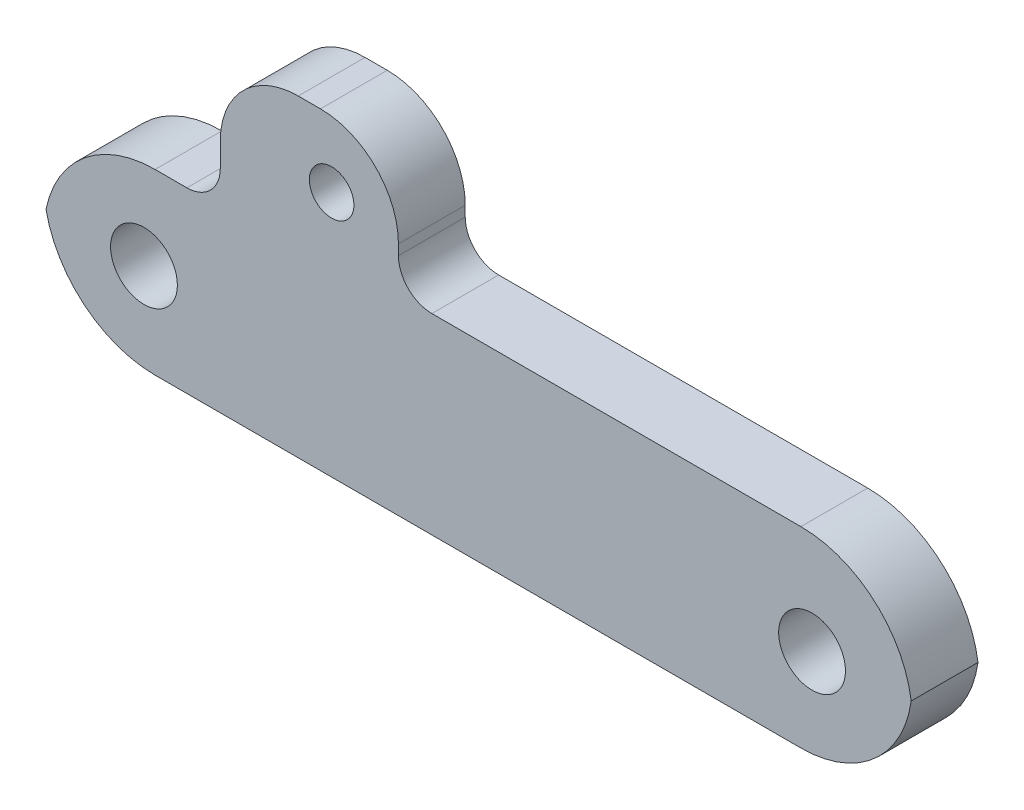
ISO-10303-21;
HEADER;
FILE_DESCRIPTION(('STEP AP214'),'2;1');
FILE_NAME('part.step','',(''),(''),'','','');
FILE_SCHEMA(('AUTOMOTIVE_DESIGN { 1 0 10303 214 1 1 1 1 }'));
ENDSEC;
DATA;
#1=APPLICATION_CONTEXT('core data for automotive mechanical design processes');
#2=APPLICATION_PROTOCOL_DEFINITION('international standard','automotive_design',2000,#1);
#3=PRODUCT_CONTEXT('',#1,'mechanical');
#4=PRODUCT('Part','Part','',(#3));
#5=PRODUCT_RELATED_PRODUCT_CATEGORY('part','',(#4));
#6=PRODUCT_DEFINITION_FORMATION('','',#4);
#7=PRODUCT_DEFINITION_CONTEXT('part definition',#1,'design');
#8=PRODUCT_DEFINITION('design','',#6,#7);
#9=PRODUCT_DEFINITION_SHAPE('','',#8);
#10=(LENGTH_UNIT() NAMED_UNIT(*) SI_UNIT(.MILLI.,.METRE.));
#11=(NAMED_UNIT(*) PLANE_ANGLE_UNIT() SI_UNIT($,.RADIAN.));
#12=(NAMED_UNIT(*) SI_UNIT($,.STERADIAN.) SOLID_ANGLE_UNIT());
#13=UNCERTAINTY_MEASURE_WITH_UNIT(LENGTH_MEASURE(1.E-05),#10,'distance_accuracy_value','');
#14=(GEOMETRIC_REPRESENTATION_CONTEXT(3) GLOBAL_UNCERTAINTY_ASSIGNED_CONTEXT((#13)) GLOBAL_UNIT_ASSIGNED_CONTEXT((#10,
#11,#12)) REPRESENTATION_CONTEXT('',''));
#15=CARTESIAN_POINT('',(0.,0.,0.));
#16=DIRECTION('',(0.,0.,1.));
#17=DIRECTION('',(1.,0.,0.));
#18=AXIS2_PLACEMENT_3D('',#15,#16,#17);
#19=CARTESIAN_POINT('',(0.,0.,3.));
#20=DIRECTION('',(0.,0.,-1.));
#21=DIRECTION('',(-1.,0.,0.));
#22=AXIS2_PLACEMENT_3D('',#19,#20,#21);
#23=PLANE('',#22);
#24=DIRECTION('',(-1.,0.,0.));
#25=VECTOR('',#24,1.);
#26=CARTESIAN_POINT('',(15.9264888743087,8.61058090411915,3.));
#27=LINE('',#26,#25);
#28=CARTESIAN_POINT('',(34.,8.61058090411915,3.));
#29=VERTEX_POINT('',#28);
#30=CARTESIAN_POINT('',(17.4264888743087,8.61058090411915,3.));
#31=VERTEX_POINT('',#30);
#32=EDGE_CURVE('E147',#29,#31,#27,.T.);
#33=ORIENTED_EDGE('',*,*,#32,.T.);
#34=CARTESIAN_POINT('',(17.4264888743087,10.1105809041191,3.));
#35=DIRECTION('',(0.,0.,-1.));
#36=DIRECTION('',(-1.,0.,0.));
#37=AXIS2_PLACEMENT_3D('',#34,#35,#36);
#38=CIRCLE('',#37,1.5);
#39=CARTESIAN_POINT('',(15.9264888743087,10.1105809041191,3.));
#40=VERTEX_POINT('',#39);
#41=EDGE_CURVE('E11',#31,#40,#38,.T.);
#42=ORIENTED_EDGE('',*,*,#41,.T.);
#43=DIRECTION('',(0.,1.,0.));
#44=VECTOR('',#43,1.);
#45=CARTESIAN_POINT('',(15.9264888743087,8.61058090411915,3.));
#46=LINE('',#45,#44);
#47=CARTESIAN_POINT('',(15.9264888743087,10.5706637065519,3.));
#48=VERTEX_POINT('',#47);
#49=EDGE_CURVE('E267',#40,#48,#46,.T.);
#50=ORIENTED_EDGE('',*,*,#49,.T.);
#51=CARTESIAN_POINT('',(12.4264888743087,10.5706637065519,3.));
#52=DIRECTION('',(0.,0.,-1.));
#53=DIRECTION('',(-1.,0.,0.));
#54=AXIS2_PLACEMENT_3D('',#51,#52,#53);
#55=CIRCLE('',#54,3.5);
#56=CARTESIAN_POINT('',(12.4264888743087,14.0706637065519,3.));
#57=VERTEX_POINT('',#56);
#58=EDGE_CURVE('E212',#48,#57,#55,.F.);
#59=ORIENTED_EDGE('',*,*,#58,.T.);
#60=DIRECTION('',(-1.,0.,0.));
#61=VECTOR('',#60,1.);
#62=CARTESIAN_POINT('',(7.92648887430874,14.0706637065519,3.));
#63=LINE('',#62,#61);
#64=CARTESIAN_POINT('',(11.4264888743087,14.0706637065519,3.));
#65=VERTEX_POINT('',#64);
#66=EDGE_CURVE('E258',#57,#65,#63,.T.);
#67=ORIENTED_EDGE('',*,*,#66,.T.);
#68=CARTESIAN_POINT('',(11.4264888743087,10.5706637065519,3.));
#69=DIRECTION('',(0.,0.,-1.));
#70=DIRECTION('',(-1.,0.,0.));
#71=AXIS2_PLACEMENT_3D('',#68,#69,#70);
#72=CIRCLE('',#71,3.5);
#73=CARTESIAN_POINT('',(7.92648887430874,10.5706637065519,3.));
#74=VERTEX_POINT('',#73);
#75=EDGE_CURVE('E210',#65,#74,#72,.F.);
#76=ORIENTED_EDGE('',*,*,#75,.T.);
#77=DIRECTION('',(0.,-1.,0.));
#78=VECTOR('',#77,1.);
#79=CARTESIAN_POINT('',(7.92648887430874,8.,3.));
#80=LINE('',#79,#78);
#81=CARTESIAN_POINT('',(7.92648887430874,9.5,3.));
#82=VERTEX_POINT('',#81);
#83=EDGE_CURVE('E235',#74,#82,#80,.T.);
#84=ORIENTED_EDGE('',*,*,#83,.T.);
#85=CARTESIAN_POINT('',(6.42648887430874,9.5,3.));
#86=DIRECTION('',(0.,0.,-1.));
#87=DIRECTION('',(-1.,0.,0.));
#88=AXIS2_PLACEMENT_3D('',#85,#86,#87);
#89=CIRCLE('',#88,1.5);
#90=CARTESIAN_POINT('',(6.42648887430874,8.,3.));
#91=VERTEX_POINT('',#90);
#92=EDGE_CURVE('E228',#82,#91,#89,.T.);
#93=ORIENTED_EDGE('',*,*,#92,.T.);
#94=DIRECTION('',(-1.,0.,0.));
#95=VECTOR('',#94,1.);
#96=CARTESIAN_POINT('',(0.,8.,3.));
#97=LINE('',#96,#95);
#98=CARTESIAN_POINT('',(5.,8.,3.));
#99=VERTEX_POINT('',#98);
#100=EDGE_CURVE('E149',#91,#99,#97,.T.);
#101=ORIENTED_EDGE('',*,*,#100,.T.);
#102=CARTESIAN_POINT('',(5.,3.,3.));
#103=DIRECTION('',(0.,0.,-1.));
#104=DIRECTION('',(-1.,0.,0.));
#105=AXIS2_PLACEMENT_3D('',#102,#103,#104);
#106=CIRCLE('',#105,5.);
#107=CARTESIAN_POINT('',(0.101020514433644,4.,3.));
#108=VERTEX_POINT('',#107);
#109=EDGE_CURVE('E142',#99,#108,#106,.F.);
#110=ORIENTED_EDGE('',*,*,#109,.T.);
#111=CARTESIAN_POINT('',(5.,5.,3.));
#112=DIRECTION('',(0.,0.,-1.));
#113=DIRECTION('',(-1.,0.,0.));
#114=AXIS2_PLACEMENT_3D('',#111,#112,#113);
#115=CIRCLE('',#114,5.);
#116=CARTESIAN_POINT('',(5.,0.,3.));
#117=VERTEX_POINT('',#116);
#118=EDGE_CURVE('E178',#108,#117,#115,.F.);
#119=ORIENTED_EDGE('',*,*,#118,.T.);
#120=DIRECTION('',(1.,0.,0.));
#121=VECTOR('',#120,1.);
#122=CARTESIAN_POINT('',(0.,0.,3.));
#123=LINE('',#122,#121);
#124=CARTESIAN_POINT('',(34.,0.,3.));
#125=VERTEX_POINT('',#124);
#126=EDGE_CURVE('E170',#117,#125,#123,.T.);
#127=ORIENTED_EDGE('',*,*,#126,.T.);
#128=CARTESIAN_POINT('',(34.,5.,3.));
#129=DIRECTION('',(0.,0.,-1.));
#130=DIRECTION('',(-1.,0.,0.));
#131=AXIS2_PLACEMENT_3D('',#128,#129,#130);
#132=CIRCLE('',#131,5.);
#133=CARTESIAN_POINT('',(38.9515026652523,4.30529045205957,3.));
#134=VERTEX_POINT('',#133);
#135=EDGE_CURVE('E180',#125,#134,#132,.F.);
#136=ORIENTED_EDGE('',*,*,#135,.T.);
#137=CARTESIAN_POINT('',(34.,3.61058090411915,3.));
#138=DIRECTION('',(0.,0.,-1.));
#139=DIRECTION('',(-1.,0.,0.));
#140=AXIS2_PLACEMENT_3D('',#137,#138,#139);
#141=CIRCLE('',#140,5.);
#142=EDGE_CURVE('E182',#134,#29,#141,.F.);
#143=ORIENTED_EDGE('',*,*,#142,.T.);
#144=EDGE_LOOP('',(#33,#42,#50,#59,#67,#76,#84,#93,#101,#110,#119,#127,#136,#143));
#145=FACE_BOUND('',#144,.T.);
#146=CARTESIAN_POINT('',(4.5,4.,3.));
#147=DIRECTION('',(0.,0.,1.));
#148=DIRECTION('',(1.,0.,0.));
#149=AXIS2_PLACEMENT_3D('',#146,#147,#148);
#150=CIRCLE('',#149,1.5);
#151=CARTESIAN_POINT('',(6.,4.,3.));
#152=VERTEX_POINT('',#151);
#153=EDGE_CURVE('E160',#152,#152,#150,.T.);
#154=ORIENTED_EDGE('',*,*,#153,.F.);
#155=EDGE_LOOP('',(#154));
#156=FACE_BOUND('',#155,.T.);
#157=CARTESIAN_POINT('',(34.5,4.,3.));
#158=DIRECTION('',(0.,0.,1.));
#159=DIRECTION('',(1.,0.,0.));
#160=AXIS2_PLACEMENT_3D('',#157,#158,#159);
#161=CIRCLE('',#160,1.5);
#162=CARTESIAN_POINT('',(36.,4.,3.));
#163=VERTEX_POINT('',#162);
#164=EDGE_CURVE('E280',#163,#163,#161,.T.);
#165=ORIENTED_EDGE('',*,*,#164,.F.);
#166=EDGE_LOOP('',(#165));
#167=FACE_BOUND('',#166,.T.);
#168=CARTESIAN_POINT('',(12.9264888743087,11.070663706552,3.));
#169=DIRECTION('',(0.,0.,1.));
#170=DIRECTION('',(1.,0.,0.));
#171=AXIS2_PLACEMENT_3D('',#168,#169,#170);
#172=CIRCLE('',#171,1.);
#173=CARTESIAN_POINT('',(13.9264888743087,11.070663706552,3.));
#174=VERTEX_POINT('',#173);
#175=EDGE_CURVE('E286',#174,#174,#172,.T.);
#176=ORIENTED_EDGE('',*,*,#175,.F.);
#177=EDGE_LOOP('',(#176));
#178=FACE_BOUND('',#177,.T.);
#179=ADVANCED_FACE('F33',(#145,#156,#167,#178),#23,.F.);
#180=CARTESIAN_POINT('',(0.,0.,0.));
#181=DIRECTION('',(0.,0.,-1.));
#182=DIRECTION('',(-1.,0.,0.));
#183=AXIS2_PLACEMENT_3D('',#180,#181,#182);
#184=PLANE('',#183);
#185=CARTESIAN_POINT('',(34.5,4.,0.));
#186=DIRECTION('',(0.,0.,1.));
#187=DIRECTION('',(1.,0.,0.));
#188=AXIS2_PLACEMENT_3D('',#185,#186,#187);
#189=CIRCLE('',#188,1.5);
#190=CARTESIAN_POINT('',(36.,4.,0.));
#191=VERTEX_POINT('',#190);
#192=EDGE_CURVE('E283',#191,#191,#189,.T.);
#193=ORIENTED_EDGE('',*,*,#192,.T.);
#194=EDGE_LOOP('',(#193));
#195=FACE_BOUND('',#194,.T.);
#196=DIRECTION('',(-1.,0.,0.));
#197=VECTOR('',#196,1.);
#198=CARTESIAN_POINT('',(7.92648887430874,14.0706637065519,0.));
#199=LINE('',#198,#197);
#200=CARTESIAN_POINT('',(12.4264888743087,14.0706637065519,0.));
#201=VERTEX_POINT('',#200);
#202=CARTESIAN_POINT('',(11.4264888743087,14.0706637065519,0.));
#203=VERTEX_POINT('',#202);
#204=EDGE_CURVE('E157',#201,#203,#199,.T.);
#205=ORIENTED_EDGE('',*,*,#204,.F.);
#206=CARTESIAN_POINT('',(12.4264888743087,10.5706637065519,0.));
#207=DIRECTION('',(0.,0.,-1.));
#208=DIRECTION('',(-1.,0.,0.));
#209=AXIS2_PLACEMENT_3D('',#206,#207,#208);
#210=CIRCLE('',#209,3.5);
#211=CARTESIAN_POINT('',(15.9264888743087,10.5706637065519,0.));
#212=VERTEX_POINT('',#211);
#213=EDGE_CURVE('E204',#201,#212,#210,.T.);
#214=ORIENTED_EDGE('',*,*,#213,.T.);
#215=DIRECTION('',(0.,1.,0.));
#216=VECTOR('',#215,1.);
#217=CARTESIAN_POINT('',(15.9264888743087,8.61058090411915,0.));
#218=LINE('',#217,#216);
#219=CARTESIAN_POINT('',(15.9264888743087,10.1105809041191,0.));
#220=VERTEX_POINT('',#219);
#221=EDGE_CURVE('E154',#220,#212,#218,.T.);
#222=ORIENTED_EDGE('',*,*,#221,.F.);
#223=CARTESIAN_POINT('',(17.4264888743087,10.1105809041191,0.));
#224=DIRECTION('',(0.,0.,-1.));
#225=DIRECTION('',(-1.,0.,0.));
#226=AXIS2_PLACEMENT_3D('',#223,#224,#225);
#227=CIRCLE('',#226,1.5);
#228=CARTESIAN_POINT('',(17.4264888743087,8.61058090411915,0.));
#229=VERTEX_POINT('',#228);
#230=EDGE_CURVE('E41',#220,#229,#227,.F.);
#231=ORIENTED_EDGE('',*,*,#230,.T.);
#232=DIRECTION('',(-1.,0.,0.));
#233=VECTOR('',#232,1.);
#234=CARTESIAN_POINT('',(15.9264888743087,8.61058090411915,0.));
#235=LINE('',#234,#233);
#236=CARTESIAN_POINT('',(34.,8.61058090411915,0.));
#237=VERTEX_POINT('',#236);
#238=EDGE_CURVE('E146',#237,#229,#235,.T.);
#239=ORIENTED_EDGE('',*,*,#238,.F.);
#240=CARTESIAN_POINT('',(34.,3.61058090411915,0.));
#241=DIRECTION('',(0.,0.,-1.));
#242=DIRECTION('',(-1.,0.,0.));
#243=AXIS2_PLACEMENT_3D('',#240,#241,#242);
#244=CIRCLE('',#243,5.);
#245=CARTESIAN_POINT('',(38.9515026652523,4.30529045205957,0.));
#246=VERTEX_POINT('',#245);
#247=EDGE_CURVE('E134',#237,#246,#244,.T.);
#248=ORIENTED_EDGE('',*,*,#247,.T.);
#249=CARTESIAN_POINT('',(34.,5.,0.));
#250=DIRECTION('',(0.,0.,-1.));
#251=DIRECTION('',(-1.,0.,0.));
#252=AXIS2_PLACEMENT_3D('',#249,#250,#251);
#253=CIRCLE('',#252,5.);
#254=CARTESIAN_POINT('',(34.,0.,0.));
#255=VERTEX_POINT('',#254);
#256=EDGE_CURVE('E143',#246,#255,#253,.T.);
#257=ORIENTED_EDGE('',*,*,#256,.T.);
#258=DIRECTION('',(1.,0.,0.));
#259=VECTOR('',#258,1.);
#260=CARTESIAN_POINT('',(0.,0.,0.));
#261=LINE('',#260,#259);
#262=CARTESIAN_POINT('',(5.,0.,0.));
#263=VERTEX_POINT('',#262);
#264=EDGE_CURVE('E155',#263,#255,#261,.T.);
#265=ORIENTED_EDGE('',*,*,#264,.F.);
#266=CARTESIAN_POINT('',(5.,5.,0.));
#267=DIRECTION('',(0.,0.,-1.));
#268=DIRECTION('',(-1.,0.,0.));
#269=AXIS2_PLACEMENT_3D('',#266,#267,#268);
#270=CIRCLE('',#269,5.);
#271=CARTESIAN_POINT('',(0.101020514433644,4.,0.));
#272=VERTEX_POINT('',#271);
#273=EDGE_CURVE('E174',#263,#272,#270,.T.);
#274=ORIENTED_EDGE('',*,*,#273,.T.);
#275=CARTESIAN_POINT('',(5.,3.,0.));
#276=DIRECTION('',(0.,0.,-1.));
#277=DIRECTION('',(-1.,0.,0.));
#278=AXIS2_PLACEMENT_3D('',#275,#276,#277);
#279=CIRCLE('',#278,5.);
#280=CARTESIAN_POINT('',(5.,8.,0.));
#281=VERTEX_POINT('',#280);
#282=EDGE_CURVE('E148',#272,#281,#279,.T.);
#283=ORIENTED_EDGE('',*,*,#282,.T.);
#284=DIRECTION('',(-1.,0.,0.));
#285=VECTOR('',#284,1.);
#286=CARTESIAN_POINT('',(0.,8.,0.));
#287=LINE('',#286,#285);
#288=CARTESIAN_POINT('',(6.42648887430874,8.,0.));
#289=VERTEX_POINT('',#288);
#290=EDGE_CURVE('E169',#289,#281,#287,.T.);
#291=ORIENTED_EDGE('',*,*,#290,.F.);
#292=CARTESIAN_POINT('',(6.42648887430874,9.5,0.));
#293=DIRECTION('',(0.,0.,-1.));
#294=DIRECTION('',(-1.,0.,0.));
#295=AXIS2_PLACEMENT_3D('',#292,#293,#294);
#296=CIRCLE('',#295,1.5);
#297=CARTESIAN_POINT('',(7.92648887430874,9.5,0.));
#298=VERTEX_POINT('',#297);
#299=EDGE_CURVE('E226',#289,#298,#296,.F.);
#300=ORIENTED_EDGE('',*,*,#299,.T.);
#301=DIRECTION('',(0.,-1.,0.));
#302=VECTOR('',#301,1.);
#303=CARTESIAN_POINT('',(7.92648887430874,8.,0.));
#304=LINE('',#303,#302);
#305=CARTESIAN_POINT('',(7.92648887430874,10.5706637065519,0.));
#306=VERTEX_POINT('',#305);
#307=EDGE_CURVE('E166',#306,#298,#304,.T.);
#308=ORIENTED_EDGE('',*,*,#307,.F.);
#309=CARTESIAN_POINT('',(11.4264888743087,10.5706637065519,0.));
#310=DIRECTION('',(0.,0.,-1.));
#311=DIRECTION('',(-1.,0.,0.));
#312=AXIS2_PLACEMENT_3D('',#309,#310,#311);
#313=CIRCLE('',#312,3.5);
#314=EDGE_CURVE('E202',#306,#203,#313,.T.);
#315=ORIENTED_EDGE('',*,*,#314,.T.);
#316=EDGE_LOOP('',(#205,#214,#222,#231,#239,#248,#257,#265,#274,#283,#291,#300,#308,#315));
#317=FACE_BOUND('',#316,.T.);
#318=CARTESIAN_POINT('',(4.5,4.,0.));
#319=DIRECTION('',(0.,0.,1.));
#320=DIRECTION('',(1.,0.,0.));
#321=AXIS2_PLACEMENT_3D('',#318,#319,#320);
#322=CIRCLE('',#321,1.5);
#323=CARTESIAN_POINT('',(6.,4.,0.));
#324=VERTEX_POINT('',#323);
#325=EDGE_CURVE('E277',#324,#324,#322,.T.);
#326=ORIENTED_EDGE('',*,*,#325,.T.);
#327=EDGE_LOOP('',(#326));
#328=FACE_BOUND('',#327,.T.);
#329=CARTESIAN_POINT('',(12.9264888743087,11.070663706552,0.));
#330=DIRECTION('',(0.,0.,1.));
#331=DIRECTION('',(1.,0.,0.));
#332=AXIS2_PLACEMENT_3D('',#329,#330,#331);
#333=CIRCLE('',#332,1.);
#334=CARTESIAN_POINT('',(13.9264888743087,11.070663706552,0.));
#335=VERTEX_POINT('',#334);
#336=EDGE_CURVE('E194',#335,#335,#333,.T.);
#337=ORIENTED_EDGE('',*,*,#336,.T.);
#338=EDGE_LOOP('',(#337));
#339=FACE_BOUND('',#338,.T.);
#340=ADVANCED_FACE('F152',(#195,#317,#328,#339),#184,.T.);
#341=CARTESIAN_POINT('',(0.,0.,3.));
#342=DIRECTION('',(0.,1.,0.));
#343=DIRECTION('',(0.,0.,1.));
#344=AXIS2_PLACEMENT_3D('',#341,#342,#343);
#345=PLANE('',#344);
#346=ORIENTED_EDGE('',*,*,#264,.T.);
#347=DIRECTION('',(0.,0.,-1.));
#348=VECTOR('',#347,1.);
#349=CARTESIAN_POINT('',(34.,0.,3.));
#350=LINE('',#349,#348);
#351=EDGE_CURVE('E187',#255,#125,#350,.F.);
#352=ORIENTED_EDGE('',*,*,#351,.T.);
#353=ORIENTED_EDGE('',*,*,#126,.F.);
#354=DIRECTION('',(0.,0.,-1.));
#355=VECTOR('',#354,1.);
#356=CARTESIAN_POINT('',(5.,0.,3.));
#357=LINE('',#356,#355);
#358=EDGE_CURVE('E184',#117,#263,#357,.T.);
#359=ORIENTED_EDGE('',*,*,#358,.T.);
#360=EDGE_LOOP('',(#346,#352,#353,#359));
#361=FACE_BOUND('',#360,.T.);
#362=ADVANCED_FACE('F302',(#361),#345,.F.);
#363=CARTESIAN_POINT('',(15.9264888743087,8.61058090411915,3.));
#364=DIRECTION('',(0.,-1.,0.));
#365=DIRECTION('',(0.,0.,-1.));
#366=AXIS2_PLACEMENT_3D('',#363,#364,#365);
#367=PLANE('',#366);
#368=ORIENTED_EDGE('',*,*,#238,.T.);
#369=DIRECTION('',(0.,0.,-1.));
#370=VECTOR('',#369,1.);
#371=CARTESIAN_POINT('',(17.4264888743087,8.61058090411915,3.));
#372=LINE('',#371,#370);
#373=EDGE_CURVE('E54',#229,#31,#372,.F.);
#374=ORIENTED_EDGE('',*,*,#373,.T.);
#375=ORIENTED_EDGE('',*,*,#32,.F.);
#376=DIRECTION('',(0.,0.,-1.));
#377=VECTOR('',#376,1.);
#378=CARTESIAN_POINT('',(34.,8.61058090411915,3.));
#379=LINE('',#378,#377);
#380=EDGE_CURVE('E138',#29,#237,#379,.T.);
#381=ORIENTED_EDGE('',*,*,#380,.T.);
#382=EDGE_LOOP('',(#368,#374,#375,#381));
#383=FACE_BOUND('',#382,.T.);
#384=ADVANCED_FACE('F145',(#383),#367,.F.);
#385=CARTESIAN_POINT('',(15.9264888743087,8.61058090411915,3.));
#386=DIRECTION('',(-1.,0.,0.));
#387=DIRECTION('',(0.,0.,1.));
#388=AXIS2_PLACEMENT_3D('',#385,#386,#387);
#389=PLANE('',#388);
#390=ORIENTED_EDGE('',*,*,#49,.F.);
#391=DIRECTION('',(0.,0.,-1.));
#392=VECTOR('',#391,1.);
#393=CARTESIAN_POINT('',(15.9264888743087,10.1105809041191,0.));
#394=LINE('',#393,#392);
#395=EDGE_CURVE('E222',#40,#220,#394,.T.);
#396=ORIENTED_EDGE('',*,*,#395,.T.);
#397=ORIENTED_EDGE('',*,*,#221,.T.);
#398=DIRECTION('',(0.,0.,-1.));
#399=VECTOR('',#398,1.);
#400=CARTESIAN_POINT('',(15.9264888743087,10.5706637065519,3.));
#401=LINE('',#400,#399);
#402=EDGE_CURVE('E207',#212,#48,#401,.F.);
#403=ORIENTED_EDGE('',*,*,#402,.T.);
#404=EDGE_LOOP('',(#390,#396,#397,#403));
#405=FACE_BOUND('',#404,.T.);
#406=ADVANCED_FACE('F265',(#405),#389,.F.);
#407=CARTESIAN_POINT('',(7.92648887430874,14.0706637065519,3.));
#408=DIRECTION('',(0.,-1.,0.));
#409=DIRECTION('',(0.,0.,-1.));
#410=AXIS2_PLACEMENT_3D('',#407,#408,#409);
#411=PLANE('',#410);
#412=ORIENTED_EDGE('',*,*,#66,.F.);
#413=DIRECTION('',(0.,0.,-1.));
#414=VECTOR('',#413,1.);
#415=CARTESIAN_POINT('',(12.4264888743087,14.0706637065519,3.));
#416=LINE('',#415,#414);
#417=EDGE_CURVE('E199',#57,#201,#416,.T.);
#418=ORIENTED_EDGE('',*,*,#417,.T.);
#419=ORIENTED_EDGE('',*,*,#204,.T.);
#420=DIRECTION('',(0.,0.,-1.));
#421=VECTOR('',#420,1.);
#422=CARTESIAN_POINT('',(11.4264888743087,14.0706637065519,3.));
#423=LINE('',#422,#421);
#424=EDGE_CURVE('E192',#203,#65,#423,.F.);
#425=ORIENTED_EDGE('',*,*,#424,.T.);
#426=EDGE_LOOP('',(#412,#418,#419,#425));
#427=FACE_BOUND('',#426,.T.);
#428=ADVANCED_FACE('F255',(#427),#411,.F.);
#429=CARTESIAN_POINT('',(7.92648887430874,8.,3.));
#430=DIRECTION('',(1.,0.,0.));
#431=DIRECTION('',(0.,0.,-1.));
#432=AXIS2_PLACEMENT_3D('',#429,#430,#431);
#433=PLANE('',#432);
#434=ORIENTED_EDGE('',*,*,#307,.T.);
#435=DIRECTION('',(0.,0.,-1.));
#436=VECTOR('',#435,1.);
#437=CARTESIAN_POINT('',(7.92648887430874,9.5,3.));
#438=LINE('',#437,#436);
#439=EDGE_CURVE('E220',#298,#82,#438,.F.);
#440=ORIENTED_EDGE('',*,*,#439,.T.);
#441=ORIENTED_EDGE('',*,*,#83,.F.);
#442=DIRECTION('',(0.,0.,-1.));
#443=VECTOR('',#442,1.);
#444=CARTESIAN_POINT('',(7.92648887430874,10.5706637065519,3.));
#445=LINE('',#444,#443);
#446=EDGE_CURVE('E214',#74,#306,#445,.T.);
#447=ORIENTED_EDGE('',*,*,#446,.T.);
#448=EDGE_LOOP('',(#434,#440,#441,#447));
#449=FACE_BOUND('',#448,.T.);
#450=ADVANCED_FACE('F247',(#449),#433,.F.);
#451=CARTESIAN_POINT('',(0.,8.,3.));
#452=DIRECTION('',(0.,-1.,0.));
#453=DIRECTION('',(0.,0.,-1.));
#454=AXIS2_PLACEMENT_3D('',#451,#452,#453);
#455=PLANE('',#454);
#456=ORIENTED_EDGE('',*,*,#100,.F.);
#457=DIRECTION('',(0.,0.,-1.));
#458=VECTOR('',#457,1.);
#459=CARTESIAN_POINT('',(6.42648887430874,8.,0.));
#460=LINE('',#459,#458);
#461=EDGE_CURVE('E217',#91,#289,#460,.T.);
#462=ORIENTED_EDGE('',*,*,#461,.T.);
#463=ORIENTED_EDGE('',*,*,#290,.T.);
#464=DIRECTION('',(0.,0.,-1.));
#465=VECTOR('',#464,1.);
#466=CARTESIAN_POINT('',(5.,8.,3.));
#467=LINE('',#466,#465);
#468=EDGE_CURVE('E189',#281,#99,#467,.F.);
#469=ORIENTED_EDGE('',*,*,#468,.T.);
#470=EDGE_LOOP('',(#456,#462,#463,#469));
#471=FACE_BOUND('',#470,.T.);
#472=ADVANCED_FACE('F240',(#471),#455,.F.);
#473=CARTESIAN_POINT('',(4.5,4.,3.));
#474=DIRECTION('',(0.,0.,-1.));
#475=DIRECTION('',(-1.,0.,0.));
#476=AXIS2_PLACEMENT_3D('',#473,#474,#475);
#477=CYLINDRICAL_SURFACE('',#476,1.5);
#478=ORIENTED_EDGE('',*,*,#153,.T.);
#479=EDGE_LOOP('',(#478));
#480=FACE_BOUND('',#479,.T.);
#481=ORIENTED_EDGE('',*,*,#325,.F.);
#482=EDGE_LOOP('',(#481));
#483=FACE_BOUND('',#482,.T.);
#484=ADVANCED_FACE('F306',(#480,#483),#477,.F.);
#485=CARTESIAN_POINT('',(34.5,4.,3.));
#486=DIRECTION('',(0.,0.,-1.));
#487=DIRECTION('',(-1.,0.,0.));
#488=AXIS2_PLACEMENT_3D('',#485,#486,#487);
#489=CYLINDRICAL_SURFACE('',#488,1.5);
#490=ORIENTED_EDGE('',*,*,#164,.T.);
#491=EDGE_LOOP('',(#490));
#492=FACE_BOUND('',#491,.T.);
#493=ORIENTED_EDGE('',*,*,#192,.F.);
#494=EDGE_LOOP('',(#493));
#495=FACE_BOUND('',#494,.T.);
#496=ADVANCED_FACE('F442',(#492,#495),#489,.F.);
#497=CARTESIAN_POINT('',(12.9264888743087,11.070663706552,3.));
#498=DIRECTION('',(0.,0.,-1.));
#499=DIRECTION('',(-1.,0.,0.));
#500=AXIS2_PLACEMENT_3D('',#497,#498,#499);
#501=CYLINDRICAL_SURFACE('',#500,1.);
#502=ORIENTED_EDGE('',*,*,#175,.T.);
#503=EDGE_LOOP('',(#502));
#504=FACE_BOUND('',#503,.T.);
#505=ORIENTED_EDGE('',*,*,#336,.F.);
#506=EDGE_LOOP('',(#505));
#507=FACE_BOUND('',#506,.T.);
#508=ADVANCED_FACE('F294',(#504,#507),#501,.F.);
#509=CARTESIAN_POINT('',(34.,5.,3.));
#510=DIRECTION('',(0.,0.,-1.));
#511=DIRECTION('',(-1.,0.,0.));
#512=AXIS2_PLACEMENT_3D('',#509,#510,#511);
#513=CYLINDRICAL_SURFACE('',#512,5.);
#514=DIRECTION('',(0.,0.,-1.));
#515=VECTOR('',#514,1.);
#516=CARTESIAN_POINT('',(38.9515026652523,4.30529045205957,1.5));
#517=LINE('',#516,#515);
#518=EDGE_CURVE('E140',#134,#246,#517,.T.);
#519=ORIENTED_EDGE('',*,*,#518,.F.);
#520=ORIENTED_EDGE('',*,*,#135,.F.);
#521=ORIENTED_EDGE('',*,*,#351,.F.);
#522=ORIENTED_EDGE('',*,*,#256,.F.);
#523=EDGE_LOOP('',(#519,#520,#521,#522));
#524=FACE_BOUND('',#523,.T.);
#525=ADVANCED_FACE('F325',(#524),#513,.T.);
#526=CARTESIAN_POINT('',(34.,3.61058090411915,3.));
#527=DIRECTION('',(0.,0.,-1.));
#528=DIRECTION('',(-1.,0.,0.));
#529=AXIS2_PLACEMENT_3D('',#526,#527,#528);
#530=CYLINDRICAL_SURFACE('',#529,5.);
#531=ORIENTED_EDGE('',*,*,#142,.F.);
#532=ORIENTED_EDGE('',*,*,#518,.T.);
#533=ORIENTED_EDGE('',*,*,#247,.F.);
#534=ORIENTED_EDGE('',*,*,#380,.F.);
#535=EDGE_LOOP('',(#531,#532,#533,#534));
#536=FACE_BOUND('',#535,.T.);
#537=ADVANCED_FACE('F137',(#536),#530,.T.);
#538=CARTESIAN_POINT('',(5.,3.,3.));
#539=DIRECTION('',(0.,0.,-1.));
#540=DIRECTION('',(-1.,0.,0.));
#541=AXIS2_PLACEMENT_3D('',#538,#539,#540);
#542=CYLINDRICAL_SURFACE('',#541,5.);
#543=DIRECTION('',(0.,0.,-1.));
#544=VECTOR('',#543,1.);
#545=CARTESIAN_POINT('',(0.101020514433644,4.,1.5));
#546=LINE('',#545,#544);
#547=EDGE_CURVE('E195',#108,#272,#546,.T.);
#548=ORIENTED_EDGE('',*,*,#547,.F.);
#549=ORIENTED_EDGE('',*,*,#109,.F.);
#550=ORIENTED_EDGE('',*,*,#468,.F.);
#551=ORIENTED_EDGE('',*,*,#282,.F.);
#552=EDGE_LOOP('',(#548,#549,#550,#551));
#553=FACE_BOUND('',#552,.T.);
#554=ADVANCED_FACE('F324',(#553),#542,.T.);
#555=CARTESIAN_POINT('',(5.,5.,3.));
#556=DIRECTION('',(0.,0.,-1.));
#557=DIRECTION('',(-1.,0.,0.));
#558=AXIS2_PLACEMENT_3D('',#555,#556,#557);
#559=CYLINDRICAL_SURFACE('',#558,5.);
#560=ORIENTED_EDGE('',*,*,#118,.F.);
#561=ORIENTED_EDGE('',*,*,#547,.T.);
#562=ORIENTED_EDGE('',*,*,#273,.F.);
#563=ORIENTED_EDGE('',*,*,#358,.F.);
#564=EDGE_LOOP('',(#560,#561,#562,#563));
#565=FACE_BOUND('',#564,.T.);
#566=ADVANCED_FACE('F329',(#565),#559,.T.);
#567=CARTESIAN_POINT('',(12.4264888743087,10.5706637065519,3.));
#568=DIRECTION('',(0.,0.,-1.));
#569=DIRECTION('',(-1.,0.,0.));
#570=AXIS2_PLACEMENT_3D('',#567,#568,#569);
#571=CYLINDRICAL_SURFACE('',#570,3.5);
#572=ORIENTED_EDGE('',*,*,#58,.F.);
#573=ORIENTED_EDGE('',*,*,#402,.F.);
#574=ORIENTED_EDGE('',*,*,#213,.F.);
#575=ORIENTED_EDGE('',*,*,#417,.F.);
#576=EDGE_LOOP('',(#572,#573,#574,#575));
#577=FACE_BOUND('',#576,.T.);
#578=ADVANCED_FACE('F261',(#577),#571,.T.);
#579=CARTESIAN_POINT('',(11.4264888743087,10.5706637065519,3.));
#580=DIRECTION('',(0.,0.,-1.));
#581=DIRECTION('',(-1.,0.,0.));
#582=AXIS2_PLACEMENT_3D('',#579,#580,#581);
#583=CYLINDRICAL_SURFACE('',#582,3.5);
#584=ORIENTED_EDGE('',*,*,#75,.F.);
#585=ORIENTED_EDGE('',*,*,#424,.F.);
#586=ORIENTED_EDGE('',*,*,#314,.F.);
#587=ORIENTED_EDGE('',*,*,#446,.F.);
#588=EDGE_LOOP('',(#584,#585,#586,#587));
#589=FACE_BOUND('',#588,.T.);
#590=ADVANCED_FACE('F251',(#589),#583,.T.);
#591=CARTESIAN_POINT('',(6.42648887430874,9.5,3.));
#592=DIRECTION('',(0.,0.,1.));
#593=DIRECTION('',(1.,0.,0.));
#594=AXIS2_PLACEMENT_3D('',#591,#592,#593);
#595=CYLINDRICAL_SURFACE('',#594,1.5);
#596=ORIENTED_EDGE('',*,*,#92,.F.);
#597=ORIENTED_EDGE('',*,*,#439,.F.);
#598=ORIENTED_EDGE('',*,*,#299,.F.);
#599=ORIENTED_EDGE('',*,*,#461,.F.);
#600=EDGE_LOOP('',(#596,#597,#598,#599));
#601=FACE_BOUND('',#600,.T.);
#602=ADVANCED_FACE('F244',(#601),#595,.F.);
#603=CARTESIAN_POINT('',(17.4264888743087,10.1105809041191,3.));
#604=DIRECTION('',(0.,0.,1.));
#605=DIRECTION('',(1.,0.,0.));
#606=AXIS2_PLACEMENT_3D('',#603,#604,#605);
#607=CYLINDRICAL_SURFACE('',#606,1.5);
#608=ORIENTED_EDGE('',*,*,#41,.F.);
#609=ORIENTED_EDGE('',*,*,#373,.F.);
#610=ORIENTED_EDGE('',*,*,#230,.F.);
#611=ORIENTED_EDGE('',*,*,#395,.F.);
#612=EDGE_LOOP('',(#608,#609,#610,#611));
#613=FACE_BOUND('',#612,.T.);
#614=ADVANCED_FACE('F35',(#613),#607,.F.);
#615=CLOSED_SHELL('',(#179,#340,#362,#384,#406,#428,#450,#472,#484,#496,#508,#525,#537,#554,
#566,#578,#590,#602,#614));
#616=MANIFOLD_SOLID_BREP('B2',#615);
#617=ADVANCED_BREP_SHAPE_REPRESENTATION('',(#18,#616),#14);
#618=SHAPE_DEFINITION_REPRESENTATION(#9,#617);
ENDSEC;
END-ISO-10303-21;
